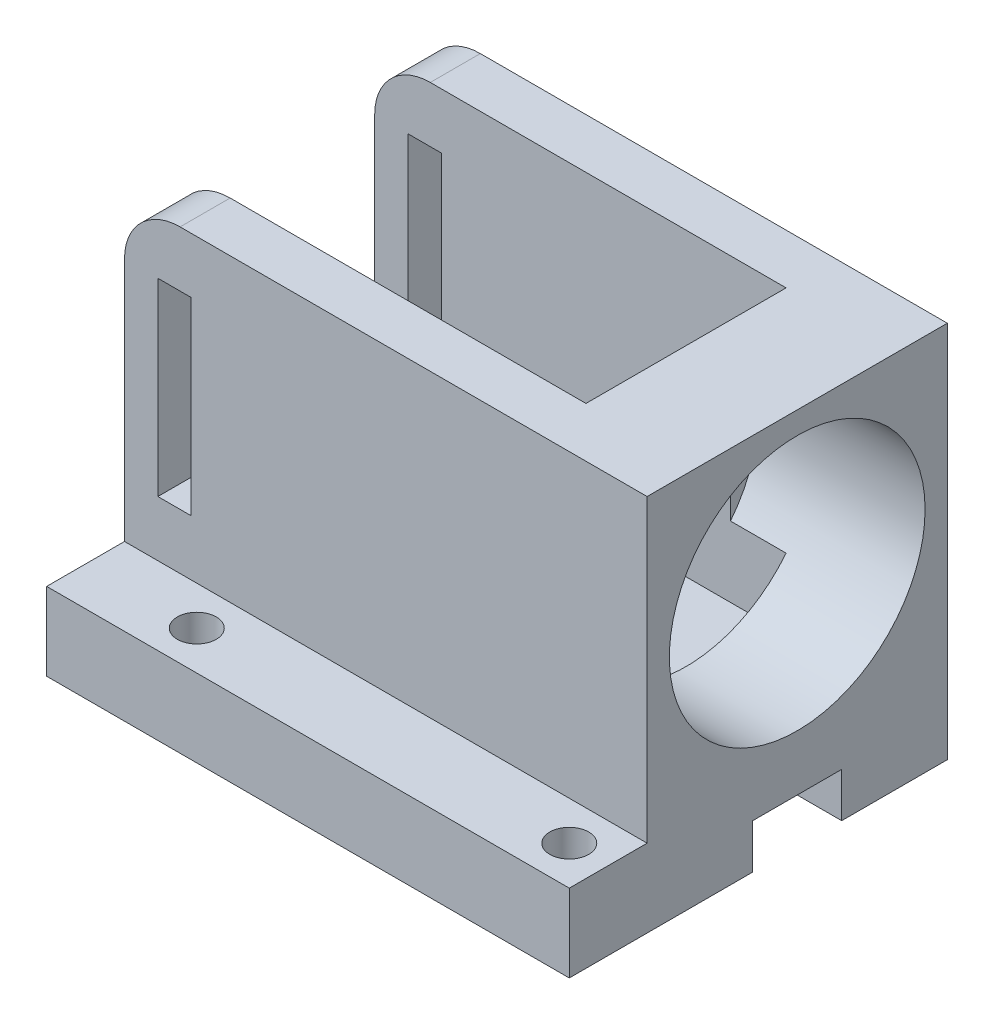
ISO-10303-21;
HEADER;
FILE_DESCRIPTION(('STEP AP214'),'2;1');
FILE_NAME('part.step','',(''),(''),'','','');
FILE_SCHEMA(('AUTOMOTIVE_DESIGN { 1 0 10303 214 1 1 1 1 }'));
ENDSEC;
DATA;
#1=APPLICATION_CONTEXT('core data for automotive mechanical design processes');
#2=APPLICATION_PROTOCOL_DEFINITION('international standard','automotive_design',2000,#1);
#3=PRODUCT_CONTEXT('',#1,'mechanical');
#4=PRODUCT('Part','Part','',(#3));
#5=PRODUCT_RELATED_PRODUCT_CATEGORY('part','',(#4));
#6=PRODUCT_DEFINITION_FORMATION('','',#4);
#7=PRODUCT_DEFINITION_CONTEXT('part definition',#1,'design');
#8=PRODUCT_DEFINITION('design','',#6,#7);
#9=PRODUCT_DEFINITION_SHAPE('','',#8);
#10=(LENGTH_UNIT() NAMED_UNIT(*) SI_UNIT(.MILLI.,.METRE.));
#11=(NAMED_UNIT(*) PLANE_ANGLE_UNIT() SI_UNIT($,.RADIAN.));
#12=(NAMED_UNIT(*) SI_UNIT($,.STERADIAN.) SOLID_ANGLE_UNIT());
#13=UNCERTAINTY_MEASURE_WITH_UNIT(LENGTH_MEASURE(1.E-05),#10,'distance_accuracy_value','');
#14=(GEOMETRIC_REPRESENTATION_CONTEXT(3) GLOBAL_UNCERTAINTY_ASSIGNED_CONTEXT((#13)) GLOBAL_UNIT_ASSIGNED_CONTEXT((#10,
#11,#12)) REPRESENTATION_CONTEXT('',''));
#15=CARTESIAN_POINT('',(0.,0.,0.));
#16=DIRECTION('',(0.,0.,1.));
#17=DIRECTION('',(1.,0.,0.));
#18=AXIS2_PLACEMENT_3D('',#15,#16,#17);
#19=CARTESIAN_POINT('',(0.,7.,0.));
#20=DIRECTION('',(0.,-1.,0.));
#21=DIRECTION('',(0.,0.,-1.));
#22=AXIS2_PLACEMENT_3D('',#19,#20,#21);
#23=PLANE('',#22);
#24=DIRECTION('',(0.,0.,-1.));
#25=VECTOR('',#24,1.);
#26=CARTESIAN_POINT('',(23.5,7.,17.));
#27=LINE('',#26,#25);
#28=CARTESIAN_POINT('',(23.5,7.,17.));
#29=VERTEX_POINT('',#28);
#30=CARTESIAN_POINT('',(23.5,7.,10.));
#31=VERTEX_POINT('',#30);
#32=EDGE_CURVE('E392',#29,#31,#27,.T.);
#33=ORIENTED_EDGE('',*,*,#32,.T.);
#34=DIRECTION('',(-1.,0.,0.));
#35=VECTOR('',#34,1.);
#36=CARTESIAN_POINT('',(0.,7.,10.));
#37=LINE('',#36,#35);
#38=CARTESIAN_POINT('',(-23.5,7.,10.));
#39=VERTEX_POINT('',#38);
#40=EDGE_CURVE('E338',#31,#39,#37,.T.);
#41=ORIENTED_EDGE('',*,*,#40,.T.);
#42=DIRECTION('',(0.,0.,1.));
#43=VECTOR('',#42,1.);
#44=CARTESIAN_POINT('',(-23.5,7.,17.));
#45=LINE('',#44,#43);
#46=CARTESIAN_POINT('',(-23.5,7.,17.));
#47=VERTEX_POINT('',#46);
#48=EDGE_CURVE('E395',#39,#47,#45,.T.);
#49=ORIENTED_EDGE('',*,*,#48,.T.);
#50=DIRECTION('',(1.,0.,0.));
#51=VECTOR('',#50,1.);
#52=CARTESIAN_POINT('',(-23.5,7.,17.));
#53=LINE('',#52,#51);
#54=EDGE_CURVE('E398',#47,#29,#53,.T.);
#55=ORIENTED_EDGE('',*,*,#54,.T.);
#56=EDGE_LOOP('',(#33,#41,#49,#55));
#57=FACE_BOUND('',#56,.T.);
#58=CARTESIAN_POINT('',(20.,7.,13.5));
#59=DIRECTION('',(0.,1.,0.));
#60=DIRECTION('',(0.,0.,1.));
#61=AXIS2_PLACEMENT_3D('',#58,#59,#60);
#62=CIRCLE('',#61,1.75000000000002);
#63=CARTESIAN_POINT('',(20.,7.,15.25));
#64=VERTEX_POINT('',#63);
#65=EDGE_CURVE('E360',#64,#64,#62,.T.);
#66=ORIENTED_EDGE('',*,*,#65,.F.);
#67=EDGE_LOOP('',(#66));
#68=FACE_BOUND('',#67,.T.);
#69=CARTESIAN_POINT('',(-13.5,7.,13.5));
#70=DIRECTION('',(0.,1.,0.));
#71=DIRECTION('',(0.,0.,1.));
#72=AXIS2_PLACEMENT_3D('',#69,#70,#71);
#73=CIRCLE('',#72,1.75000000000001);
#74=CARTESIAN_POINT('',(-13.5,7.,15.25));
#75=VERTEX_POINT('',#74);
#76=EDGE_CURVE('E354',#75,#75,#73,.T.);
#77=ORIENTED_EDGE('',*,*,#76,.F.);
#78=EDGE_LOOP('',(#77));
#79=FACE_BOUND('',#78,.T.);
#80=ADVANCED_FACE('F41',(#57,#68,#79),#23,.F.);
#81=CARTESIAN_POINT('',(23.5,7.,17.));
#82=DIRECTION('',(-1.,0.,0.));
#83=DIRECTION('',(0.,0.,1.));
#84=AXIS2_PLACEMENT_3D('',#81,#82,#83);
#85=PLANE('',#84);
#86=CARTESIAN_POINT('',(23.5,20.5,-3.5));
#87=DIRECTION('',(1.,0.,0.));
#88=DIRECTION('',(0.,0.,-1.));
#89=AXIS2_PLACEMENT_3D('',#86,#87,#88);
#90=CIRCLE('',#89,11.5);
#91=CARTESIAN_POINT('',(23.5,20.5,-15.));
#92=VERTEX_POINT('',#91);
#93=EDGE_CURVE('E332',#92,#92,#90,.T.);
#94=ORIENTED_EDGE('',*,*,#93,.F.);
#95=EDGE_LOOP('',(#94));
#96=FACE_BOUND('',#95,.T.);
#97=DIRECTION('',(0.,1.,0.));
#98=VECTOR('',#97,1.);
#99=CARTESIAN_POINT('',(23.5,0.,0.499999999999999));
#100=LINE('',#99,#98);
#101=CARTESIAN_POINT('',(23.5,0.,0.499999999999999));
#102=VERTEX_POINT('',#101);
#103=CARTESIAN_POINT('',(23.5,4.,0.499999999999999));
#104=VERTEX_POINT('',#103);
#105=EDGE_CURVE('E371',#102,#104,#100,.T.);
#106=ORIENTED_EDGE('',*,*,#105,.T.);
#107=DIRECTION('',(0.,0.,-1.));
#108=VECTOR('',#107,1.);
#109=CARTESIAN_POINT('',(23.5,4.,0.));
#110=LINE('',#109,#108);
#111=CARTESIAN_POINT('',(23.5,4.,-7.5));
#112=VERTEX_POINT('',#111);
#113=EDGE_CURVE('E378',#104,#112,#110,.T.);
#114=ORIENTED_EDGE('',*,*,#113,.T.);
#115=DIRECTION('',(0.,1.,0.));
#116=VECTOR('',#115,1.);
#117=CARTESIAN_POINT('',(23.5,0.,-7.5));
#118=LINE('',#117,#116);
#119=CARTESIAN_POINT('',(23.5,0.,-7.5));
#120=VERTEX_POINT('',#119);
#121=EDGE_CURVE('E366',#120,#112,#118,.T.);
#122=ORIENTED_EDGE('',*,*,#121,.F.);
#123=DIRECTION('',(0.,0.,-1.));
#124=VECTOR('',#123,1.);
#125=CARTESIAN_POINT('',(23.5,0.,17.));
#126=LINE('',#125,#124);
#127=CARTESIAN_POINT('',(23.5,0.,-17.));
#128=VERTEX_POINT('',#127);
#129=EDGE_CURVE('E386',#120,#128,#126,.T.);
#130=ORIENTED_EDGE('',*,*,#129,.T.);
#131=DIRECTION('',(0.,-1.,0.));
#132=VECTOR('',#131,1.);
#133=CARTESIAN_POINT('',(23.5,7.,-17.));
#134=LINE('',#133,#132);
#135=CARTESIAN_POINT('',(23.5,34.,-17.));
#136=VERTEX_POINT('',#135);
#137=EDGE_CURVE('E419',#136,#128,#134,.T.);
#138=ORIENTED_EDGE('',*,*,#137,.F.);
#139=DIRECTION('',(0.,0.,-1.));
#140=VECTOR('',#139,1.);
#141=CARTESIAN_POINT('',(23.5,34.,0.));
#142=LINE('',#141,#140);
#143=CARTESIAN_POINT('',(23.5,34.,10.));
#144=VERTEX_POINT('',#143);
#145=EDGE_CURVE('E342',#144,#136,#142,.T.);
#146=ORIENTED_EDGE('',*,*,#145,.F.);
#147=DIRECTION('',(0.,-1.,0.));
#148=VECTOR('',#147,1.);
#149=CARTESIAN_POINT('',(23.5,34.,10.));
#150=LINE('',#149,#148);
#151=EDGE_CURVE('E352',#144,#31,#150,.T.);
#152=ORIENTED_EDGE('',*,*,#151,.T.);
#153=ORIENTED_EDGE('',*,*,#32,.F.);
#154=DIRECTION('',(0.,-1.,0.));
#155=VECTOR('',#154,1.);
#156=CARTESIAN_POINT('',(23.5,7.,17.));
#157=LINE('',#156,#155);
#158=CARTESIAN_POINT('',(23.5,0.,17.));
#159=VERTEX_POINT('',#158);
#160=EDGE_CURVE('E400',#29,#159,#157,.T.);
#161=ORIENTED_EDGE('',*,*,#160,.T.);
#162=EDGE_CURVE('E401',#159,#102,#126,.T.);
#163=ORIENTED_EDGE('',*,*,#162,.T.);
#164=EDGE_LOOP('',(#106,#114,#122,#130,#138,#146,#152,#153,#161,#163));
#165=FACE_BOUND('',#164,.T.);
#166=ADVANCED_FACE('F464',(#96,#165),#85,.F.);
#167=CARTESIAN_POINT('',(-23.5,7.,17.));
#168=DIRECTION('',(1.,0.,0.));
#169=DIRECTION('',(0.,0.,-1.));
#170=AXIS2_PLACEMENT_3D('',#167,#168,#169);
#171=PLANE('',#170);
#172=DIRECTION('',(0.,-1.,0.));
#173=VECTOR('',#172,1.);
#174=CARTESIAN_POINT('',(-23.5,34.,10.));
#175=LINE('',#174,#173);
#176=CARTESIAN_POINT('',(-23.5,29.,10.));
#177=VERTEX_POINT('',#176);
#178=EDGE_CURVE('E348',#177,#39,#175,.T.);
#179=ORIENTED_EDGE('',*,*,#178,.F.);
#180=DIRECTION('',(0.,0.,1.));
#181=VECTOR('',#180,1.);
#182=CARTESIAN_POINT('',(-23.5,29.,5.5));
#183=LINE('',#182,#181);
#184=CARTESIAN_POINT('',(-23.5,29.,5.5));
#185=VERTEX_POINT('',#184);
#186=EDGE_CURVE('E56',#177,#185,#183,.F.);
#187=ORIENTED_EDGE('',*,*,#186,.T.);
#188=DIRECTION('',(0.,-1.,0.));
#189=VECTOR('',#188,1.);
#190=CARTESIAN_POINT('',(-23.5,34.,5.5));
#191=LINE('',#190,#189);
#192=CARTESIAN_POINT('',(-23.5,7.00000000000001,5.5));
#193=VERTEX_POINT('',#192);
#194=EDGE_CURVE('E304',#185,#193,#191,.T.);
#195=ORIENTED_EDGE('',*,*,#194,.T.);
#196=DIRECTION('',(0.,0.,-1.));
#197=VECTOR('',#196,1.);
#198=CARTESIAN_POINT('',(-23.5,7.00000000000001,5.5));
#199=LINE('',#198,#197);
#200=CARTESIAN_POINT('',(-23.5,7.00000000000001,-12.5));
#201=VERTEX_POINT('',#200);
#202=EDGE_CURVE('E307',#193,#201,#199,.T.);
#203=ORIENTED_EDGE('',*,*,#202,.T.);
#204=DIRECTION('',(0.,1.,0.));
#205=VECTOR('',#204,1.);
#206=CARTESIAN_POINT('',(-23.5,34.,-12.5));
#207=LINE('',#206,#205);
#208=CARTESIAN_POINT('',(-23.5,29.,-12.5));
#209=VERTEX_POINT('',#208);
#210=EDGE_CURVE('E302',#201,#209,#207,.T.);
#211=ORIENTED_EDGE('',*,*,#210,.T.);
#212=DIRECTION('',(0.,0.,1.));
#213=VECTOR('',#212,1.);
#214=CARTESIAN_POINT('',(-23.5,29.,-17.));
#215=LINE('',#214,#213);
#216=CARTESIAN_POINT('',(-23.5,29.,-17.));
#217=VERTEX_POINT('',#216);
#218=EDGE_CURVE('E63',#209,#217,#215,.F.);
#219=ORIENTED_EDGE('',*,*,#218,.T.);
#220=DIRECTION('',(0.,-1.,0.));
#221=VECTOR('',#220,1.);
#222=CARTESIAN_POINT('',(-23.5,7.,-17.));
#223=LINE('',#222,#221);
#224=CARTESIAN_POINT('',(-23.5,0.,-17.));
#225=VERTEX_POINT('',#224);
#226=EDGE_CURVE('E417',#217,#225,#223,.T.);
#227=ORIENTED_EDGE('',*,*,#226,.T.);
#228=DIRECTION('',(0.,0.,1.));
#229=VECTOR('',#228,1.);
#230=CARTESIAN_POINT('',(-23.5,0.,17.));
#231=LINE('',#230,#229);
#232=CARTESIAN_POINT('',(-23.5,0.,-7.5));
#233=VERTEX_POINT('',#232);
#234=EDGE_CURVE('E408',#225,#233,#231,.T.);
#235=ORIENTED_EDGE('',*,*,#234,.T.);
#236=DIRECTION('',(0.,1.,0.));
#237=VECTOR('',#236,1.);
#238=CARTESIAN_POINT('',(-23.5,0.,-7.5));
#239=LINE('',#238,#237);
#240=CARTESIAN_POINT('',(-23.5,4.,-7.5));
#241=VERTEX_POINT('',#240);
#242=EDGE_CURVE('E367',#233,#241,#239,.T.);
#243=ORIENTED_EDGE('',*,*,#242,.T.);
#244=DIRECTION('',(0.,0.,-1.));
#245=VECTOR('',#244,1.);
#246=CARTESIAN_POINT('',(-23.5,4.,0.));
#247=LINE('',#246,#245);
#248=CARTESIAN_POINT('',(-23.5,4.,0.499999999999999));
#249=VERTEX_POINT('',#248);
#250=EDGE_CURVE('E370',#249,#241,#247,.T.);
#251=ORIENTED_EDGE('',*,*,#250,.F.);
#252=DIRECTION('',(0.,1.,0.));
#253=VECTOR('',#252,1.);
#254=CARTESIAN_POINT('',(-23.5,0.,0.499999999999999));
#255=LINE('',#254,#253);
#256=CARTESIAN_POINT('',(-23.5,0.,0.499999999999999));
#257=VERTEX_POINT('',#256);
#258=EDGE_CURVE('E373',#257,#249,#255,.T.);
#259=ORIENTED_EDGE('',*,*,#258,.F.);
#260=CARTESIAN_POINT('',(-23.5,0.,17.));
#261=VERTEX_POINT('',#260);
#262=EDGE_CURVE('E407',#257,#261,#231,.T.);
#263=ORIENTED_EDGE('',*,*,#262,.T.);
#264=DIRECTION('',(0.,-1.,0.));
#265=VECTOR('',#264,1.);
#266=CARTESIAN_POINT('',(-23.5,7.,17.));
#267=LINE('',#266,#265);
#268=EDGE_CURVE('E414',#47,#261,#267,.T.);
#269=ORIENTED_EDGE('',*,*,#268,.F.);
#270=ORIENTED_EDGE('',*,*,#48,.F.);
#271=EDGE_LOOP('',(#179,#187,#195,#203,#211,#219,#227,#235,#243,#251,#259,#263,#269,#270));
#272=FACE_BOUND('',#271,.T.);
#273=ADVANCED_FACE('F454',(#272),#171,.F.);
#274=CARTESIAN_POINT('',(0.,0.,0.));
#275=DIRECTION('',(0.,-1.,0.));
#276=DIRECTION('',(0.,0.,-1.));
#277=AXIS2_PLACEMENT_3D('',#274,#275,#276);
#278=PLANE('',#277);
#279=CARTESIAN_POINT('',(-13.5,0.,13.5));
#280=DIRECTION('',(0.,-1.,0.));
#281=DIRECTION('',(0.,0.,-1.));
#282=AXIS2_PLACEMENT_3D('',#279,#280,#281);
#283=CIRCLE('',#282,1.75000000000001);
#284=CARTESIAN_POINT('',(-13.5,0.,11.75));
#285=VERTEX_POINT('',#284);
#286=EDGE_CURVE('E357',#285,#285,#283,.T.);
#287=ORIENTED_EDGE('',*,*,#286,.F.);
#288=EDGE_LOOP('',(#287));
#289=FACE_BOUND('',#288,.T.);
#290=CARTESIAN_POINT('',(20.,0.,13.5));
#291=DIRECTION('',(0.,-1.,0.));
#292=DIRECTION('',(0.,0.,-1.));
#293=AXIS2_PLACEMENT_3D('',#290,#291,#292);
#294=CIRCLE('',#293,1.75000000000001);
#295=CARTESIAN_POINT('',(20.,0.,11.75));
#296=VERTEX_POINT('',#295);
#297=EDGE_CURVE('E363',#296,#296,#294,.T.);
#298=ORIENTED_EDGE('',*,*,#297,.F.);
#299=EDGE_LOOP('',(#298));
#300=FACE_BOUND('',#299,.T.);
#301=ORIENTED_EDGE('',*,*,#262,.F.);
#302=DIRECTION('',(1.,0.,0.));
#303=VECTOR('',#302,1.);
#304=CARTESIAN_POINT('',(-23.5,0.,0.499999999999999));
#305=LINE('',#304,#303);
#306=EDGE_CURVE('E383',#257,#102,#305,.T.);
#307=ORIENTED_EDGE('',*,*,#306,.T.);
#308=ORIENTED_EDGE('',*,*,#162,.F.);
#309=DIRECTION('',(1.,0.,0.));
#310=VECTOR('',#309,1.);
#311=CARTESIAN_POINT('',(-23.5,0.,17.));
#312=LINE('',#311,#310);
#313=EDGE_CURVE('E396',#261,#159,#312,.T.);
#314=ORIENTED_EDGE('',*,*,#313,.F.);
#315=EDGE_LOOP('',(#301,#307,#308,#314));
#316=FACE_BOUND('',#315,.T.);
#317=ADVANCED_FACE('F489',(#289,#300,#316),#278,.T.);
#318=CARTESIAN_POINT('',(-23.5,7.,-17.));
#319=DIRECTION('',(0.,0.,1.));
#320=DIRECTION('',(1.,0.,0.));
#321=AXIS2_PLACEMENT_3D('',#318,#319,#320);
#322=PLANE('',#321);
#323=DIRECTION('',(-1.,0.,0.));
#324=VECTOR('',#323,1.);
#325=CARTESIAN_POINT('',(-20.5,29.,-17.));
#326=LINE('',#325,#324);
#327=CARTESIAN_POINT('',(-17.5,29.,-17.));
#328=VERTEX_POINT('',#327);
#329=CARTESIAN_POINT('',(-20.5,29.,-17.));
#330=VERTEX_POINT('',#329);
#331=EDGE_CURVE('E253',#328,#330,#326,.T.);
#332=ORIENTED_EDGE('',*,*,#331,.T.);
#333=DIRECTION('',(0.,-1.,0.));
#334=VECTOR('',#333,1.);
#335=CARTESIAN_POINT('',(-20.5,29.,-17.));
#336=LINE('',#335,#334);
#337=CARTESIAN_POINT('',(-20.5,12.,-17.));
#338=VERTEX_POINT('',#337);
#339=EDGE_CURVE('E231',#330,#338,#336,.T.);
#340=ORIENTED_EDGE('',*,*,#339,.T.);
#341=DIRECTION('',(1.,0.,0.));
#342=VECTOR('',#341,1.);
#343=CARTESIAN_POINT('',(-20.5,12.,-17.));
#344=LINE('',#343,#342);
#345=CARTESIAN_POINT('',(-17.5,12.,-17.));
#346=VERTEX_POINT('',#345);
#347=EDGE_CURVE('E242',#338,#346,#344,.T.);
#348=ORIENTED_EDGE('',*,*,#347,.T.);
#349=DIRECTION('',(0.,1.,0.));
#350=VECTOR('',#349,1.);
#351=CARTESIAN_POINT('',(-17.5,29.,-17.));
#352=LINE('',#351,#350);
#353=EDGE_CURVE('E248',#346,#328,#352,.T.);
#354=ORIENTED_EDGE('',*,*,#353,.T.);
#355=EDGE_LOOP('',(#332,#340,#348,#354));
#356=FACE_BOUND('',#355,.T.);
#357=ORIENTED_EDGE('',*,*,#226,.F.);
#358=CARTESIAN_POINT('',(-18.5,29.,-17.));
#359=DIRECTION('',(0.,0.,1.));
#360=DIRECTION('',(1.,0.,0.));
#361=AXIS2_PLACEMENT_3D('',#358,#359,#360);
#362=CIRCLE('',#361,5.);
#363=CARTESIAN_POINT('',(-18.5,34.,-17.));
#364=VERTEX_POINT('',#363);
#365=EDGE_CURVE('E11',#217,#364,#362,.F.);
#366=ORIENTED_EDGE('',*,*,#365,.T.);
#367=DIRECTION('',(-1.,0.,0.));
#368=VECTOR('',#367,1.);
#369=CARTESIAN_POINT('',(0.,34.,-17.));
#370=LINE('',#369,#368);
#371=EDGE_CURVE('E345',#136,#364,#370,.T.);
#372=ORIENTED_EDGE('',*,*,#371,.F.);
#373=ORIENTED_EDGE('',*,*,#137,.T.);
#374=DIRECTION('',(-1.,0.,0.));
#375=VECTOR('',#374,1.);
#376=CARTESIAN_POINT('',(-23.5,0.,-17.));
#377=LINE('',#376,#375);
#378=EDGE_CURVE('E404',#128,#225,#377,.T.);
#379=ORIENTED_EDGE('',*,*,#378,.T.);
#380=EDGE_LOOP('',(#357,#366,#372,#373,#379));
#381=FACE_BOUND('',#380,.T.);
#382=ADVANCED_FACE('F250',(#356,#381),#322,.F.);
#383=CARTESIAN_POINT('',(-23.5,7.,17.));
#384=DIRECTION('',(0.,0.,-1.));
#385=DIRECTION('',(-1.,0.,0.));
#386=AXIS2_PLACEMENT_3D('',#383,#384,#385);
#387=PLANE('',#386);
#388=ORIENTED_EDGE('',*,*,#313,.T.);
#389=ORIENTED_EDGE('',*,*,#160,.F.);
#390=ORIENTED_EDGE('',*,*,#54,.F.);
#391=ORIENTED_EDGE('',*,*,#268,.T.);
#392=EDGE_LOOP('',(#388,#389,#390,#391));
#393=FACE_BOUND('',#392,.T.);
#394=ADVANCED_FACE('F493',(#393),#387,.F.);
#395=DIRECTION('',(1.,0.,0.));
#396=VECTOR('',#395,1.);
#397=CARTESIAN_POINT('',(-23.5,0.,-7.5));
#398=LINE('',#397,#396);
#399=EDGE_CURVE('E375',#233,#120,#398,.T.);
#400=ORIENTED_EDGE('',*,*,#399,.F.);
#401=ORIENTED_EDGE('',*,*,#234,.F.);
#402=ORIENTED_EDGE('',*,*,#378,.F.);
#403=ORIENTED_EDGE('',*,*,#129,.F.);
#404=EDGE_LOOP('',(#400,#401,#402,#403));
#405=FACE_BOUND('',#404,.T.);
#406=ADVANCED_FACE('F473',(#405),#278,.T.);
#407=CARTESIAN_POINT('',(-23.5,0.,0.499999999999999));
#408=DIRECTION('',(0.,0.,-1.));
#409=DIRECTION('',(-1.,0.,0.));
#410=AXIS2_PLACEMENT_3D('',#407,#408,#409);
#411=PLANE('',#410);
#412=ORIENTED_EDGE('',*,*,#105,.F.);
#413=ORIENTED_EDGE('',*,*,#306,.F.);
#414=ORIENTED_EDGE('',*,*,#258,.T.);
#415=DIRECTION('',(1.,0.,0.));
#416=VECTOR('',#415,1.);
#417=CARTESIAN_POINT('',(-23.5,4.,0.499999999999999));
#418=LINE('',#417,#416);
#419=EDGE_CURVE('E387',#249,#104,#418,.T.);
#420=ORIENTED_EDGE('',*,*,#419,.T.);
#421=EDGE_LOOP('',(#412,#413,#414,#420));
#422=FACE_BOUND('',#421,.T.);
#423=ADVANCED_FACE('F484',(#422),#411,.T.);
#424=CARTESIAN_POINT('',(-23.5,4.,0.));
#425=DIRECTION('',(0.,-1.,0.));
#426=DIRECTION('',(0.,0.,-1.));
#427=AXIS2_PLACEMENT_3D('',#424,#425,#426);
#428=PLANE('',#427);
#429=ORIENTED_EDGE('',*,*,#113,.F.);
#430=ORIENTED_EDGE('',*,*,#419,.F.);
#431=ORIENTED_EDGE('',*,*,#250,.T.);
#432=DIRECTION('',(1.,0.,0.));
#433=VECTOR('',#432,1.);
#434=CARTESIAN_POINT('',(-23.5,4.,-7.5));
#435=LINE('',#434,#433);
#436=EDGE_CURVE('E389',#241,#112,#435,.T.);
#437=ORIENTED_EDGE('',*,*,#436,.T.);
#438=EDGE_LOOP('',(#429,#430,#431,#437));
#439=FACE_BOUND('',#438,.T.);
#440=ADVANCED_FACE('F481',(#439),#428,.T.);
#441=CARTESIAN_POINT('',(-23.5,0.,-7.5));
#442=DIRECTION('',(0.,0.,-1.));
#443=DIRECTION('',(-1.,0.,0.));
#444=AXIS2_PLACEMENT_3D('',#441,#442,#443);
#445=PLANE('',#444);
#446=ORIENTED_EDGE('',*,*,#121,.T.);
#447=ORIENTED_EDGE('',*,*,#436,.F.);
#448=ORIENTED_EDGE('',*,*,#242,.F.);
#449=ORIENTED_EDGE('',*,*,#399,.T.);
#450=EDGE_LOOP('',(#446,#447,#448,#449));
#451=FACE_BOUND('',#450,.T.);
#452=ADVANCED_FACE('F478',(#451),#445,.F.);
#453=CARTESIAN_POINT('',(20.,7.,13.5));
#454=DIRECTION('',(0.,1.,0.));
#455=DIRECTION('',(0.,0.,1.));
#456=AXIS2_PLACEMENT_3D('',#453,#454,#455);
#457=CYLINDRICAL_SURFACE('',#456,1.75000000000001);
#458=ORIENTED_EDGE('',*,*,#65,.T.);
#459=EDGE_LOOP('',(#458));
#460=FACE_BOUND('',#459,.T.);
#461=ORIENTED_EDGE('',*,*,#297,.T.);
#462=EDGE_LOOP('',(#461));
#463=FACE_BOUND('',#462,.T.);
#464=ADVANCED_FACE('F620',(#460,#463),#457,.F.);
#465=CARTESIAN_POINT('',(-13.5,7.,13.5));
#466=DIRECTION('',(0.,1.,0.));
#467=DIRECTION('',(0.,0.,1.));
#468=AXIS2_PLACEMENT_3D('',#465,#466,#467);
#469=CYLINDRICAL_SURFACE('',#468,1.75000000000001);
#470=ORIENTED_EDGE('',*,*,#76,.T.);
#471=EDGE_LOOP('',(#470));
#472=FACE_BOUND('',#471,.T.);
#473=ORIENTED_EDGE('',*,*,#286,.T.);
#474=EDGE_LOOP('',(#473));
#475=FACE_BOUND('',#474,.T.);
#476=ADVANCED_FACE('F618',(#472,#475),#469,.F.);
#477=CARTESIAN_POINT('',(0.,34.,10.));
#478=DIRECTION('',(0.,0.,1.));
#479=DIRECTION('',(1.,0.,0.));
#480=AXIS2_PLACEMENT_3D('',#477,#478,#479);
#481=PLANE('',#480);
#482=DIRECTION('',(0.,-1.,0.));
#483=VECTOR('',#482,1.);
#484=CARTESIAN_POINT('',(-20.5,29.,10.));
#485=LINE('',#484,#483);
#486=CARTESIAN_POINT('',(-20.5,29.,10.));
#487=VERTEX_POINT('',#486);
#488=CARTESIAN_POINT('',(-20.5,12.,10.));
#489=VERTEX_POINT('',#488);
#490=EDGE_CURVE('E262',#487,#489,#485,.T.);
#491=ORIENTED_EDGE('',*,*,#490,.F.);
#492=DIRECTION('',(-1.,0.,0.));
#493=VECTOR('',#492,1.);
#494=CARTESIAN_POINT('',(-20.5,29.,10.));
#495=LINE('',#494,#493);
#496=CARTESIAN_POINT('',(-17.5,29.,10.));
#497=VERTEX_POINT('',#496);
#498=EDGE_CURVE('E254',#497,#487,#495,.T.);
#499=ORIENTED_EDGE('',*,*,#498,.F.);
#500=DIRECTION('',(0.,1.,0.));
#501=VECTOR('',#500,1.);
#502=CARTESIAN_POINT('',(-17.5,29.,10.));
#503=LINE('',#502,#501);
#504=CARTESIAN_POINT('',(-17.5,12.,10.));
#505=VERTEX_POINT('',#504);
#506=EDGE_CURVE('E257',#505,#497,#503,.T.);
#507=ORIENTED_EDGE('',*,*,#506,.F.);
#508=DIRECTION('',(1.,0.,0.));
#509=VECTOR('',#508,1.);
#510=CARTESIAN_POINT('',(-20.5,12.,10.));
#511=LINE('',#510,#509);
#512=EDGE_CURVE('E264',#489,#505,#511,.T.);
#513=ORIENTED_EDGE('',*,*,#512,.F.);
#514=EDGE_LOOP('',(#491,#499,#507,#513));
#515=FACE_BOUND('',#514,.T.);
#516=DIRECTION('',(-1.,0.,0.));
#517=VECTOR('',#516,1.);
#518=CARTESIAN_POINT('',(0.,34.,10.));
#519=LINE('',#518,#517);
#520=CARTESIAN_POINT('',(-18.5,34.,10.));
#521=VERTEX_POINT('',#520);
#522=EDGE_CURVE('E339',#144,#521,#519,.T.);
#523=ORIENTED_EDGE('',*,*,#522,.T.);
#524=CARTESIAN_POINT('',(-18.5,29.,10.));
#525=DIRECTION('',(0.,0.,1.));
#526=DIRECTION('',(1.,0.,0.));
#527=AXIS2_PLACEMENT_3D('',#524,#525,#526);
#528=CIRCLE('',#527,5.);
#529=EDGE_CURVE('E442',#521,#177,#528,.T.);
#530=ORIENTED_EDGE('',*,*,#529,.T.);
#531=ORIENTED_EDGE('',*,*,#178,.T.);
#532=ORIENTED_EDGE('',*,*,#40,.F.);
#533=ORIENTED_EDGE('',*,*,#151,.F.);
#534=EDGE_LOOP('',(#523,#530,#531,#532,#533));
#535=FACE_BOUND('',#534,.T.);
#536=ADVANCED_FACE('F582',(#515,#535),#481,.T.);
#537=CARTESIAN_POINT('',(0.,34.,0.));
#538=DIRECTION('',(0.,1.,0.));
#539=DIRECTION('',(0.,0.,1.));
#540=AXIS2_PLACEMENT_3D('',#537,#538,#539);
#541=PLANE('',#540);
#542=DIRECTION('',(1.,0.,0.));
#543=VECTOR('',#542,1.);
#544=CARTESIAN_POINT('',(-23.5,34.,5.5));
#545=LINE('',#544,#543);
#546=CARTESIAN_POINT('',(-18.5,34.,5.5));
#547=VERTEX_POINT('',#546);
#548=CARTESIAN_POINT('',(13.5,34.,5.5));
#549=VERTEX_POINT('',#548);
#550=EDGE_CURVE('E329',#547,#549,#545,.T.);
#551=ORIENTED_EDGE('',*,*,#550,.F.);
#552=DIRECTION('',(0.,0.,1.));
#553=VECTOR('',#552,1.);
#554=CARTESIAN_POINT('',(-18.5,34.,10.));
#555=LINE('',#554,#553);
#556=EDGE_CURVE('E439',#547,#521,#555,.T.);
#557=ORIENTED_EDGE('',*,*,#556,.T.);
#558=ORIENTED_EDGE('',*,*,#522,.F.);
#559=ORIENTED_EDGE('',*,*,#145,.T.);
#560=ORIENTED_EDGE('',*,*,#371,.T.);
#561=DIRECTION('',(0.,0.,1.));
#562=VECTOR('',#561,1.);
#563=CARTESIAN_POINT('',(-18.5,34.,-12.5));
#564=LINE('',#563,#562);
#565=CARTESIAN_POINT('',(-18.5,34.,-12.5));
#566=VERTEX_POINT('',#565);
#567=EDGE_CURVE('E436',#364,#566,#564,.T.);
#568=ORIENTED_EDGE('',*,*,#567,.T.);
#569=DIRECTION('',(1.,0.,0.));
#570=VECTOR('',#569,1.);
#571=CARTESIAN_POINT('',(-23.5,34.,-12.5));
#572=LINE('',#571,#570);
#573=CARTESIAN_POINT('',(13.5,34.,-12.5));
#574=VERTEX_POINT('',#573);
#575=EDGE_CURVE('E310',#566,#574,#572,.T.);
#576=ORIENTED_EDGE('',*,*,#575,.T.);
#577=DIRECTION('',(0.,0.,1.));
#578=VECTOR('',#577,1.);
#579=CARTESIAN_POINT('',(13.5,34.,5.5));
#580=LINE('',#579,#578);
#581=EDGE_CURVE('E314',#574,#549,#580,.T.);
#582=ORIENTED_EDGE('',*,*,#581,.T.);
#583=EDGE_LOOP('',(#551,#557,#558,#559,#560,#568,#576,#582));
#584=FACE_BOUND('',#583,.T.);
#585=ADVANCED_FACE('F460',(#584),#541,.T.);
#586=CARTESIAN_POINT('',(23.5,20.5,-3.5));
#587=DIRECTION('',(1.,0.,0.));
#588=DIRECTION('',(0.,0.,-1.));
#589=AXIS2_PLACEMENT_3D('',#586,#587,#588);
#590=CYLINDRICAL_SURFACE('',#589,11.5);
#591=CARTESIAN_POINT('',(13.5,20.5,-3.5));
#592=DIRECTION('',(1.,0.,0.));
#593=DIRECTION('',(0.,0.,-1.));
#594=AXIS2_PLACEMENT_3D('',#591,#592,#593);
#595=CIRCLE('',#594,11.5);
#596=CARTESIAN_POINT('',(13.5,27.6589105316382,-12.5));
#597=VERTEX_POINT('',#596);
#598=CARTESIAN_POINT('',(13.5,27.6589105316382,5.5));
#599=VERTEX_POINT('',#598);
#600=EDGE_CURVE('E335',#597,#599,#595,.T.);
#601=ORIENTED_EDGE('',*,*,#600,.F.);
#602=DIRECTION('',(1.,0.,0.));
#603=VECTOR('',#602,1.);
#604=CARTESIAN_POINT('',(8.50000000000001,27.6589105316382,-12.5));
#605=LINE('',#604,#603);
#606=CARTESIAN_POINT('',(8.50000000000001,27.6589105316382,-12.5));
#607=VERTEX_POINT('',#606);
#608=EDGE_CURVE('E297',#607,#597,#605,.T.);
#609=ORIENTED_EDGE('',*,*,#608,.F.);
#610=CARTESIAN_POINT('',(8.50000000000001,20.5,-3.5));
#611=DIRECTION('',(1.,0.,0.));
#612=DIRECTION('',(0.,0.,-1.));
#613=AXIS2_PLACEMENT_3D('',#610,#611,#612);
#614=CIRCLE('',#613,11.5);
#615=CARTESIAN_POINT('',(8.50000000000001,13.3410894683618,-12.5));
#616=VERTEX_POINT('',#615);
#617=EDGE_CURVE('E286',#616,#607,#614,.T.);
#618=ORIENTED_EDGE('',*,*,#617,.F.);
#619=DIRECTION('',(1.,0.,0.));
#620=VECTOR('',#619,1.);
#621=CARTESIAN_POINT('',(8.50000000000001,13.3410894683618,-12.5));
#622=LINE('',#621,#620);
#623=CARTESIAN_POINT('',(13.5,13.3410894683618,-12.5));
#624=VERTEX_POINT('',#623);
#625=EDGE_CURVE('E294',#624,#616,#622,.F.);
#626=ORIENTED_EDGE('',*,*,#625,.F.);
#627=CARTESIAN_POINT('',(13.5,13.3410894683618,5.5));
#628=VERTEX_POINT('',#627);
#629=EDGE_CURVE('E325',#628,#624,#595,.T.);
#630=ORIENTED_EDGE('',*,*,#629,.F.);
#631=DIRECTION('',(1.,0.,0.));
#632=VECTOR('',#631,1.);
#633=CARTESIAN_POINT('',(8.50000000000001,13.3410894683618,5.5));
#634=LINE('',#633,#632);
#635=CARTESIAN_POINT('',(8.50000000000001,13.3410894683618,5.5));
#636=VERTEX_POINT('',#635);
#637=EDGE_CURVE('E292',#636,#628,#634,.T.);
#638=ORIENTED_EDGE('',*,*,#637,.F.);
#639=CARTESIAN_POINT('',(8.50000000000001,27.6589105316382,5.5));
#640=VERTEX_POINT('',#639);
#641=EDGE_CURVE('E288',#640,#636,#614,.T.);
#642=ORIENTED_EDGE('',*,*,#641,.F.);
#643=DIRECTION('',(1.,0.,0.));
#644=VECTOR('',#643,1.);
#645=CARTESIAN_POINT('',(8.50000000000001,27.6589105316382,5.5));
#646=LINE('',#645,#644);
#647=EDGE_CURVE('E289',#599,#640,#646,.F.);
#648=ORIENTED_EDGE('',*,*,#647,.F.);
#649=EDGE_LOOP('',(#601,#609,#618,#626,#630,#638,#642,#648));
#650=FACE_BOUND('',#649,.T.);
#651=ORIENTED_EDGE('',*,*,#93,.T.);
#652=EDGE_LOOP('',(#651));
#653=FACE_BOUND('',#652,.T.);
#654=ADVANCED_FACE('F515',(#650,#653),#590,.F.);
#655=CARTESIAN_POINT('',(13.5,0.,0.));
#656=DIRECTION('',(1.,0.,0.));
#657=DIRECTION('',(0.,0.,-1.));
#658=AXIS2_PLACEMENT_3D('',#655,#656,#657);
#659=PLANE('',#658);
#660=ORIENTED_EDGE('',*,*,#600,.T.);
#661=DIRECTION('',(0.,-1.,0.));
#662=VECTOR('',#661,1.);
#663=CARTESIAN_POINT('',(13.5,34.,5.5));
#664=LINE('',#663,#662);
#665=EDGE_CURVE('E318',#549,#599,#664,.T.);
#666=ORIENTED_EDGE('',*,*,#665,.F.);
#667=ORIENTED_EDGE('',*,*,#581,.F.);
#668=DIRECTION('',(0.,1.,0.));
#669=VECTOR('',#668,1.);
#670=CARTESIAN_POINT('',(13.5,34.,-12.5));
#671=LINE('',#670,#669);
#672=EDGE_CURVE('E301',#597,#574,#671,.T.);
#673=ORIENTED_EDGE('',*,*,#672,.F.);
#674=EDGE_LOOP('',(#660,#666,#667,#673));
#675=FACE_BOUND('',#674,.T.);
#676=ADVANCED_FACE('F510',(#675),#659,.F.);
#677=CARTESIAN_POINT('',(-23.5,34.,-12.5));
#678=DIRECTION('',(0.,0.,-1.));
#679=DIRECTION('',(-1.,0.,0.));
#680=AXIS2_PLACEMENT_3D('',#677,#678,#679);
#681=PLANE('',#680);
#682=DIRECTION('',(-1.,0.,0.));
#683=VECTOR('',#682,1.);
#684=CARTESIAN_POINT('',(-23.5,12.,-12.5));
#685=LINE('',#684,#683);
#686=CARTESIAN_POINT('',(-17.5,12.,-12.5));
#687=VERTEX_POINT('',#686);
#688=CARTESIAN_POINT('',(-20.5,12.,-12.5));
#689=VERTEX_POINT('',#688);
#690=EDGE_CURVE('E271',#687,#689,#685,.T.);
#691=ORIENTED_EDGE('',*,*,#690,.T.);
#692=DIRECTION('',(0.,1.,0.));
#693=VECTOR('',#692,1.);
#694=CARTESIAN_POINT('',(-20.5,34.,-12.5));
#695=LINE('',#694,#693);
#696=CARTESIAN_POINT('',(-20.5,29.,-12.5));
#697=VERTEX_POINT('',#696);
#698=EDGE_CURVE('E234',#689,#697,#695,.T.);
#699=ORIENTED_EDGE('',*,*,#698,.T.);
#700=DIRECTION('',(1.,0.,0.));
#701=VECTOR('',#700,1.);
#702=CARTESIAN_POINT('',(-23.5,29.,-12.5));
#703=LINE('',#702,#701);
#704=CARTESIAN_POINT('',(-17.5,29.,-12.5));
#705=VERTEX_POINT('',#704);
#706=EDGE_CURVE('E282',#697,#705,#703,.T.);
#707=ORIENTED_EDGE('',*,*,#706,.T.);
#708=DIRECTION('',(0.,-1.,0.));
#709=VECTOR('',#708,1.);
#710=CARTESIAN_POINT('',(-17.5,34.,-12.5));
#711=LINE('',#710,#709);
#712=EDGE_CURVE('E279',#705,#687,#711,.T.);
#713=ORIENTED_EDGE('',*,*,#712,.T.);
#714=EDGE_LOOP('',(#691,#699,#707,#713));
#715=FACE_BOUND('',#714,.T.);
#716=ORIENTED_EDGE('',*,*,#575,.F.);
#717=CARTESIAN_POINT('',(-18.5,29.,-12.5));
#718=DIRECTION('',(0.,0.,-1.));
#719=DIRECTION('',(-1.,0.,0.));
#720=AXIS2_PLACEMENT_3D('',#717,#718,#719);
#721=CIRCLE('',#720,5.);
#722=EDGE_CURVE('E49',#566,#209,#721,.F.);
#723=ORIENTED_EDGE('',*,*,#722,.T.);
#724=ORIENTED_EDGE('',*,*,#210,.F.);
#725=DIRECTION('',(1.,0.,0.));
#726=VECTOR('',#725,1.);
#727=CARTESIAN_POINT('',(-23.5,7.00000000000001,-12.5));
#728=LINE('',#727,#726);
#729=CARTESIAN_POINT('',(13.5,7.00000000000001,-12.5));
#730=VERTEX_POINT('',#729);
#731=EDGE_CURVE('E323',#201,#730,#728,.T.);
#732=ORIENTED_EDGE('',*,*,#731,.T.);
#733=EDGE_CURVE('E311',#730,#624,#671,.T.);
#734=ORIENTED_EDGE('',*,*,#733,.T.);
#735=ORIENTED_EDGE('',*,*,#625,.T.);
#736=DIRECTION('',(0.,-1.,0.));
#737=VECTOR('',#736,1.);
#738=CARTESIAN_POINT('',(8.50000000000001,34.,-12.5));
#739=LINE('',#738,#737);
#740=EDGE_CURVE('E299',#607,#616,#739,.T.);
#741=ORIENTED_EDGE('',*,*,#740,.F.);
#742=ORIENTED_EDGE('',*,*,#608,.T.);
#743=ORIENTED_EDGE('',*,*,#672,.T.);
#744=EDGE_LOOP('',(#716,#723,#724,#732,#734,#735,#741,#742,#743));
#745=FACE_BOUND('',#744,.T.);
#746=ADVANCED_FACE('F450',(#715,#745),#681,.F.);
#747=CARTESIAN_POINT('',(-23.5,7.00000000000001,5.5));
#748=DIRECTION('',(0.,-1.,0.));
#749=DIRECTION('',(0.,0.,-1.));
#750=AXIS2_PLACEMENT_3D('',#747,#748,#749);
#751=PLANE('',#750);
#752=DIRECTION('',(0.,0.,-1.));
#753=VECTOR('',#752,1.);
#754=CARTESIAN_POINT('',(13.5,7.00000000000001,5.5));
#755=LINE('',#754,#753);
#756=CARTESIAN_POINT('',(13.5,7.00000000000001,5.5));
#757=VERTEX_POINT('',#756);
#758=EDGE_CURVE('E305',#757,#730,#755,.T.);
#759=ORIENTED_EDGE('',*,*,#758,.T.);
#760=ORIENTED_EDGE('',*,*,#731,.F.);
#761=ORIENTED_EDGE('',*,*,#202,.F.);
#762=DIRECTION('',(1.,0.,0.));
#763=VECTOR('',#762,1.);
#764=CARTESIAN_POINT('',(-23.5,7.00000000000001,5.5));
#765=LINE('',#764,#763);
#766=EDGE_CURVE('E326',#193,#757,#765,.T.);
#767=ORIENTED_EDGE('',*,*,#766,.T.);
#768=EDGE_LOOP('',(#759,#760,#761,#767));
#769=FACE_BOUND('',#768,.T.);
#770=ADVANCED_FACE('F602',(#769),#751,.F.);
#771=CARTESIAN_POINT('',(-23.5,34.,5.5));
#772=DIRECTION('',(0.,0.,1.));
#773=DIRECTION('',(0.,-1.,0.));
#774=AXIS2_PLACEMENT_3D('',#771,#772,#773);
#775=PLANE('',#774);
#776=DIRECTION('',(-1.,0.,0.));
#777=VECTOR('',#776,1.);
#778=CARTESIAN_POINT('',(-23.5,29.,5.5));
#779=LINE('',#778,#777);
#780=CARTESIAN_POINT('',(-17.5,29.,5.5));
#781=VERTEX_POINT('',#780);
#782=CARTESIAN_POINT('',(-20.5,29.,5.5));
#783=VERTEX_POINT('',#782);
#784=EDGE_CURVE('E430',#781,#783,#779,.T.);
#785=ORIENTED_EDGE('',*,*,#784,.T.);
#786=DIRECTION('',(0.,-1.,0.));
#787=VECTOR('',#786,1.);
#788=CARTESIAN_POINT('',(-20.5,34.,5.5));
#789=LINE('',#788,#787);
#790=CARTESIAN_POINT('',(-20.5,12.,5.5));
#791=VERTEX_POINT('',#790);
#792=EDGE_CURVE('E433',#783,#791,#789,.T.);
#793=ORIENTED_EDGE('',*,*,#792,.T.);
#794=DIRECTION('',(1.,0.,0.));
#795=VECTOR('',#794,1.);
#796=CARTESIAN_POINT('',(-23.5,12.,5.5));
#797=LINE('',#796,#795);
#798=CARTESIAN_POINT('',(-17.5,12.,5.5));
#799=VERTEX_POINT('',#798);
#800=EDGE_CURVE('E424',#791,#799,#797,.T.);
#801=ORIENTED_EDGE('',*,*,#800,.T.);
#802=DIRECTION('',(0.,1.,0.));
#803=VECTOR('',#802,1.);
#804=CARTESIAN_POINT('',(-17.5,34.,5.5));
#805=LINE('',#804,#803);
#806=EDGE_CURVE('E427',#799,#781,#805,.T.);
#807=ORIENTED_EDGE('',*,*,#806,.T.);
#808=EDGE_LOOP('',(#785,#793,#801,#807));
#809=FACE_BOUND('',#808,.T.);
#810=ORIENTED_EDGE('',*,*,#194,.F.);
#811=CARTESIAN_POINT('',(-18.5,29.,5.5));
#812=DIRECTION('',(0.,0.,1.));
#813=DIRECTION('',(0.,-1.,0.));
#814=AXIS2_PLACEMENT_3D('',#811,#812,#813);
#815=CIRCLE('',#814,5.);
#816=EDGE_CURVE('E446',#185,#547,#815,.F.);
#817=ORIENTED_EDGE('',*,*,#816,.T.);
#818=ORIENTED_EDGE('',*,*,#550,.T.);
#819=ORIENTED_EDGE('',*,*,#665,.T.);
#820=ORIENTED_EDGE('',*,*,#647,.T.);
#821=DIRECTION('',(0.,1.,0.));
#822=VECTOR('',#821,1.);
#823=CARTESIAN_POINT('',(8.50000000000001,34.,5.5));
#824=LINE('',#823,#822);
#825=EDGE_CURVE('E422',#636,#640,#824,.T.);
#826=ORIENTED_EDGE('',*,*,#825,.F.);
#827=ORIENTED_EDGE('',*,*,#637,.T.);
#828=EDGE_CURVE('E317',#628,#757,#664,.T.);
#829=ORIENTED_EDGE('',*,*,#828,.T.);
#830=ORIENTED_EDGE('',*,*,#766,.F.);
#831=EDGE_LOOP('',(#810,#817,#818,#819,#820,#826,#827,#829,#830));
#832=FACE_BOUND('',#831,.T.);
#833=ADVANCED_FACE('F504',(#809,#832),#775,.F.);
#834=ORIENTED_EDGE('',*,*,#629,.T.);
#835=ORIENTED_EDGE('',*,*,#733,.F.);
#836=ORIENTED_EDGE('',*,*,#758,.F.);
#837=ORIENTED_EDGE('',*,*,#828,.F.);
#838=EDGE_LOOP('',(#834,#835,#836,#837));
#839=FACE_BOUND('',#838,.T.);
#840=ADVANCED_FACE('F524',(#839),#659,.F.);
#841=CARTESIAN_POINT('',(8.50000000000001,20.5,-3.5));
#842=DIRECTION('',(1.,0.,0.));
#843=DIRECTION('',(0.,0.,-1.));
#844=AXIS2_PLACEMENT_3D('',#841,#842,#843);
#845=PLANE('',#844);
#846=ORIENTED_EDGE('',*,*,#825,.T.);
#847=ORIENTED_EDGE('',*,*,#641,.T.);
#848=EDGE_LOOP('',(#846,#847));
#849=FACE_BOUND('',#848,.T.);
#850=ADVANCED_FACE('F521',(#849),#845,.T.);
#851=ORIENTED_EDGE('',*,*,#740,.T.);
#852=ORIENTED_EDGE('',*,*,#617,.T.);
#853=EDGE_LOOP('',(#851,#852));
#854=FACE_BOUND('',#853,.T.);
#855=ADVANCED_FACE('F523',(#854),#845,.T.);
#856=CARTESIAN_POINT('',(-20.5,12.,-17.));
#857=DIRECTION('',(0.,-1.,0.));
#858=DIRECTION('',(0.,0.,-1.));
#859=AXIS2_PLACEMENT_3D('',#856,#857,#858);
#860=PLANE('',#859);
#861=DIRECTION('',(0.,0.,1.));
#862=VECTOR('',#861,1.);
#863=CARTESIAN_POINT('',(-20.5,12.,-17.));
#864=LINE('',#863,#862);
#865=EDGE_CURVE('E238',#791,#489,#864,.T.);
#866=ORIENTED_EDGE('',*,*,#865,.T.);
#867=ORIENTED_EDGE('',*,*,#512,.T.);
#868=DIRECTION('',(0.,0.,1.));
#869=VECTOR('',#868,1.);
#870=CARTESIAN_POINT('',(-17.5,12.,-17.));
#871=LINE('',#870,#869);
#872=EDGE_CURVE('E237',#799,#505,#871,.T.);
#873=ORIENTED_EDGE('',*,*,#872,.F.);
#874=ORIENTED_EDGE('',*,*,#800,.F.);
#875=EDGE_LOOP('',(#866,#867,#873,#874));
#876=FACE_BOUND('',#875,.T.);
#877=ADVANCED_FACE('F530',(#876),#860,.F.);
#878=CARTESIAN_POINT('',(-17.5,29.,-17.));
#879=DIRECTION('',(1.,0.,0.));
#880=DIRECTION('',(0.,1.,0.));
#881=AXIS2_PLACEMENT_3D('',#878,#879,#880);
#882=PLANE('',#881);
#883=ORIENTED_EDGE('',*,*,#872,.T.);
#884=ORIENTED_EDGE('',*,*,#506,.T.);
#885=DIRECTION('',(0.,0.,1.));
#886=VECTOR('',#885,1.);
#887=CARTESIAN_POINT('',(-17.5,29.,-17.));
#888=LINE('',#887,#886);
#889=EDGE_CURVE('E276',#781,#497,#888,.T.);
#890=ORIENTED_EDGE('',*,*,#889,.F.);
#891=ORIENTED_EDGE('',*,*,#806,.F.);
#892=EDGE_LOOP('',(#883,#884,#890,#891));
#893=FACE_BOUND('',#892,.T.);
#894=ADVANCED_FACE('F567',(#893),#882,.F.);
#895=CARTESIAN_POINT('',(-20.5,29.,-17.));
#896=DIRECTION('',(0.,1.,0.));
#897=DIRECTION('',(0.,0.,1.));
#898=AXIS2_PLACEMENT_3D('',#895,#896,#897);
#899=PLANE('',#898);
#900=ORIENTED_EDGE('',*,*,#889,.T.);
#901=ORIENTED_EDGE('',*,*,#498,.T.);
#902=DIRECTION('',(0.,0.,1.));
#903=VECTOR('',#902,1.);
#904=CARTESIAN_POINT('',(-20.5,29.,-17.));
#905=LINE('',#904,#903);
#906=EDGE_CURVE('E272',#783,#487,#905,.T.);
#907=ORIENTED_EDGE('',*,*,#906,.F.);
#908=ORIENTED_EDGE('',*,*,#784,.F.);
#909=EDGE_LOOP('',(#900,#901,#907,#908));
#910=FACE_BOUND('',#909,.T.);
#911=ADVANCED_FACE('F573',(#910),#899,.F.);
#912=CARTESIAN_POINT('',(-20.5,29.,-17.));
#913=DIRECTION('',(-1.,0.,0.));
#914=DIRECTION('',(0.,-1.,0.));
#915=AXIS2_PLACEMENT_3D('',#912,#913,#914);
#916=PLANE('',#915);
#917=ORIENTED_EDGE('',*,*,#906,.T.);
#918=ORIENTED_EDGE('',*,*,#490,.T.);
#919=ORIENTED_EDGE('',*,*,#865,.F.);
#920=ORIENTED_EDGE('',*,*,#792,.F.);
#921=EDGE_LOOP('',(#917,#918,#919,#920));
#922=FACE_BOUND('',#921,.T.);
#923=ADVANCED_FACE('F588',(#922),#916,.F.);
#924=EDGE_CURVE('E226',#338,#689,#864,.T.);
#925=ORIENTED_EDGE('',*,*,#924,.F.);
#926=ORIENTED_EDGE('',*,*,#339,.F.);
#927=EDGE_CURVE('E269',#330,#697,#905,.T.);
#928=ORIENTED_EDGE('',*,*,#927,.T.);
#929=ORIENTED_EDGE('',*,*,#698,.F.);
#930=EDGE_LOOP('',(#925,#926,#928,#929));
#931=FACE_BOUND('',#930,.T.);
#932=ADVANCED_FACE('F228',(#931),#916,.F.);
#933=ORIENTED_EDGE('',*,*,#927,.F.);
#934=ORIENTED_EDGE('',*,*,#331,.F.);
#935=EDGE_CURVE('E273',#328,#705,#888,.T.);
#936=ORIENTED_EDGE('',*,*,#935,.T.);
#937=ORIENTED_EDGE('',*,*,#706,.F.);
#938=EDGE_LOOP('',(#933,#934,#936,#937));
#939=FACE_BOUND('',#938,.T.);
#940=ADVANCED_FACE('F564',(#939),#899,.F.);
#941=ORIENTED_EDGE('',*,*,#935,.F.);
#942=ORIENTED_EDGE('',*,*,#353,.F.);
#943=EDGE_CURVE('E245',#346,#687,#871,.T.);
#944=ORIENTED_EDGE('',*,*,#943,.T.);
#945=ORIENTED_EDGE('',*,*,#712,.F.);
#946=EDGE_LOOP('',(#941,#942,#944,#945));
#947=FACE_BOUND('',#946,.T.);
#948=ADVANCED_FACE('F559',(#947),#882,.F.);
#949=ORIENTED_EDGE('',*,*,#943,.F.);
#950=ORIENTED_EDGE('',*,*,#347,.F.);
#951=ORIENTED_EDGE('',*,*,#924,.T.);
#952=ORIENTED_EDGE('',*,*,#690,.F.);
#953=EDGE_LOOP('',(#949,#950,#951,#952));
#954=FACE_BOUND('',#953,.T.);
#955=ADVANCED_FACE('F243',(#954),#860,.F.);
#956=CARTESIAN_POINT('',(-18.5,29.,0.));
#957=DIRECTION('',(0.,0.,-1.));
#958=DIRECTION('',(-1.,0.,0.));
#959=AXIS2_PLACEMENT_3D('',#956,#957,#958);
#960=CYLINDRICAL_SURFACE('',#959,5.);
#961=ORIENTED_EDGE('',*,*,#816,.F.);
#962=ORIENTED_EDGE('',*,*,#186,.F.);
#963=ORIENTED_EDGE('',*,*,#529,.F.);
#964=ORIENTED_EDGE('',*,*,#556,.F.);
#965=EDGE_LOOP('',(#961,#962,#963,#964));
#966=FACE_BOUND('',#965,.T.);
#967=ADVANCED_FACE('F501',(#966),#960,.T.);
#968=CARTESIAN_POINT('',(-18.5,29.,0.));
#969=DIRECTION('',(0.,0.,-1.));
#970=DIRECTION('',(-1.,0.,0.));
#971=AXIS2_PLACEMENT_3D('',#968,#969,#970);
#972=CYLINDRICAL_SURFACE('',#971,5.);
#973=ORIENTED_EDGE('',*,*,#365,.F.);
#974=ORIENTED_EDGE('',*,*,#218,.F.);
#975=ORIENTED_EDGE('',*,*,#722,.F.);
#976=ORIENTED_EDGE('',*,*,#567,.F.);
#977=EDGE_LOOP('',(#973,#974,#975,#976));
#978=FACE_BOUND('',#977,.T.);
#979=ADVANCED_FACE('F43',(#978),#972,.T.);
#980=CLOSED_SHELL('',(#80,#166,#273,#317,#382,#394,#406,#423,#440,#452,#464,#476,#536,#585,#654,
#676,#746,#770,#833,#840,#850,#855,#877,#894,#911,#923,#932,#940,#948,#955,#967,#979));
#981=MANIFOLD_SOLID_BREP('B2',#980);
#982=ADVANCED_BREP_SHAPE_REPRESENTATION('',(#18,#981),#14);
#983=SHAPE_DEFINITION_REPRESENTATION(#9,#982);
ENDSEC;
END-ISO-10303-21;
